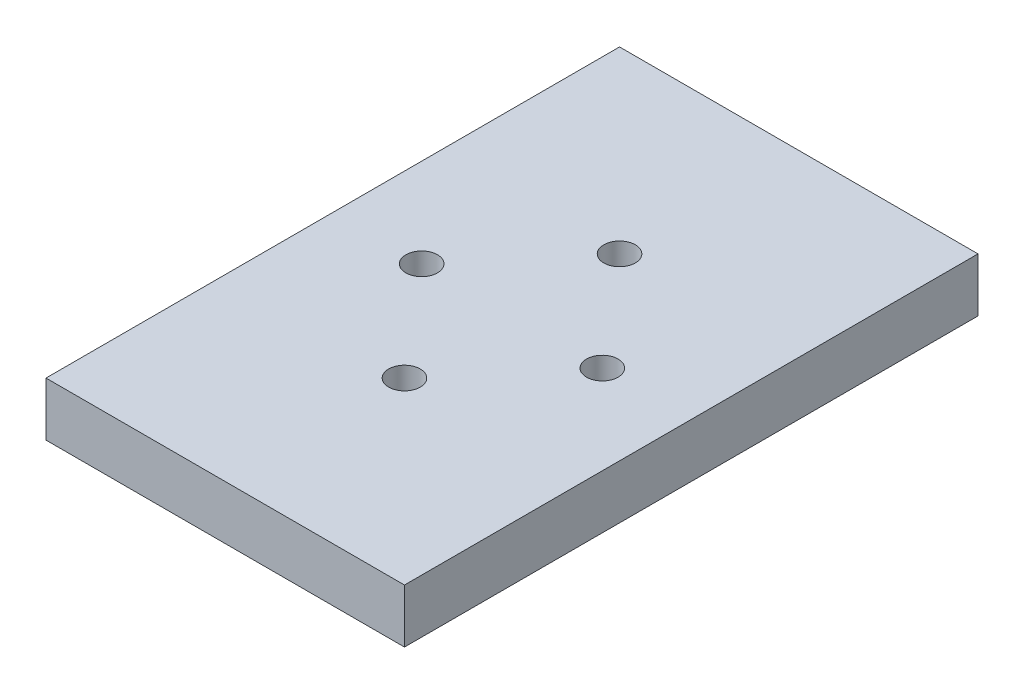
ISO-10303-21;
HEADER;
FILE_DESCRIPTION(('STEP AP214'),'2;1');
FILE_NAME('part.step','',(''),(''),'','','');
FILE_SCHEMA(('AUTOMOTIVE_DESIGN { 1 0 10303 214 1 1 1 1 }'));
ENDSEC;
DATA;
#1=APPLICATION_CONTEXT('core data for automotive mechanical design processes');
#2=APPLICATION_PROTOCOL_DEFINITION('international standard','automotive_design',2000,#1);
#3=PRODUCT_CONTEXT('',#1,'mechanical');
#4=PRODUCT('Part','Part','',(#3));
#5=PRODUCT_RELATED_PRODUCT_CATEGORY('part','',(#4));
#6=PRODUCT_DEFINITION_FORMATION('','',#4);
#7=PRODUCT_DEFINITION_CONTEXT('part definition',#1,'design');
#8=PRODUCT_DEFINITION('design','',#6,#7);
#9=PRODUCT_DEFINITION_SHAPE('','',#8);
#10=(LENGTH_UNIT() NAMED_UNIT(*) SI_UNIT(.MILLI.,.METRE.));
#11=(NAMED_UNIT(*) PLANE_ANGLE_UNIT() SI_UNIT($,.RADIAN.));
#12=(NAMED_UNIT(*) SI_UNIT($,.STERADIAN.) SOLID_ANGLE_UNIT());
#13=UNCERTAINTY_MEASURE_WITH_UNIT(LENGTH_MEASURE(1.E-05),#10,'distance_accuracy_value','');
#14=(GEOMETRIC_REPRESENTATION_CONTEXT(3) GLOBAL_UNCERTAINTY_ASSIGNED_CONTEXT((#13)) GLOBAL_UNIT_ASSIGNED_CONTEXT((#10,
#11,#12)) REPRESENTATION_CONTEXT('',''));
#15=CARTESIAN_POINT('',(0.,0.,0.));
#16=DIRECTION('',(0.,0.,1.));
#17=DIRECTION('',(1.,0.,0.));
#18=AXIS2_PLACEMENT_3D('',#15,#16,#17);
#19=CARTESIAN_POINT('',(0.,4.7625,0.));
#20=DIRECTION('',(0.,-1.,0.));
#21=DIRECTION('',(0.,0.,-1.));
#22=AXIS2_PLACEMENT_3D('',#19,#20,#21);
#23=PLANE('',#22);
#24=DIRECTION('',(0.,0.,1.));
#25=VECTOR('',#24,1.);
#26=CARTESIAN_POINT('',(0.,4.7625,0.));
#27=LINE('',#26,#25);
#28=CARTESIAN_POINT('',(0.,4.7625,-50.8));
#29=VERTEX_POINT('',#28);
#30=CARTESIAN_POINT('',(0.,4.7625,0.));
#31=VERTEX_POINT('',#30);
#32=EDGE_CURVE('E85',#29,#31,#27,.T.);
#33=ORIENTED_EDGE('',*,*,#32,.T.);
#34=DIRECTION('',(1.,0.,0.));
#35=VECTOR('',#34,1.);
#36=CARTESIAN_POINT('',(0.,4.7625,0.));
#37=LINE('',#36,#35);
#38=CARTESIAN_POINT('',(31.75,4.7625,0.));
#39=VERTEX_POINT('',#38);
#40=EDGE_CURVE('E80',#31,#39,#37,.T.);
#41=ORIENTED_EDGE('',*,*,#40,.T.);
#42=DIRECTION('',(0.,0.,-1.));
#43=VECTOR('',#42,1.);
#44=CARTESIAN_POINT('',(31.75,4.7625,0.));
#45=LINE('',#44,#43);
#46=CARTESIAN_POINT('',(31.75,4.7625,-50.8));
#47=VERTEX_POINT('',#46);
#48=EDGE_CURVE('E83',#39,#47,#45,.T.);
#49=ORIENTED_EDGE('',*,*,#48,.T.);
#50=DIRECTION('',(-1.,0.,0.));
#51=VECTOR('',#50,1.);
#52=CARTESIAN_POINT('',(0.,4.7625,-50.8));
#53=LINE('',#52,#51);
#54=EDGE_CURVE('E50',#47,#29,#53,.T.);
#55=ORIENTED_EDGE('',*,*,#54,.T.);
#56=EDGE_LOOP('',(#33,#41,#49,#55));
#57=FACE_BOUND('',#56,.T.);
#58=CARTESIAN_POINT('',(7.874,4.7625,-25.4));
#59=DIRECTION('',(0.,1.,0.));
#60=DIRECTION('',(0.,0.,1.));
#61=AXIS2_PLACEMENT_3D('',#58,#59,#60);
#62=CIRCLE('',#61,1.397);
#63=CARTESIAN_POINT('',(7.874,4.7625,-26.797));
#64=VERTEX_POINT('',#63);
#65=EDGE_CURVE('E100',#64,#64,#62,.T.);
#66=ORIENTED_EDGE('',*,*,#65,.F.);
#67=EDGE_LOOP('',(#66));
#68=FACE_BOUND('',#67,.T.);
#69=CARTESIAN_POINT('',(15.875,4.7625,-34.925));
#70=DIRECTION('',(0.,1.,0.));
#71=DIRECTION('',(0.,0.,1.));
#72=AXIS2_PLACEMENT_3D('',#69,#70,#71);
#73=CIRCLE('',#72,1.397);
#74=CARTESIAN_POINT('',(15.875,4.7625,-36.322));
#75=VERTEX_POINT('',#74);
#76=EDGE_CURVE('E115',#75,#75,#73,.T.);
#77=ORIENTED_EDGE('',*,*,#76,.F.);
#78=EDGE_LOOP('',(#77));
#79=FACE_BOUND('',#78,.T.);
#80=CARTESIAN_POINT('',(23.876,4.7625,-25.4));
#81=DIRECTION('',(0.,1.,0.));
#82=DIRECTION('',(0.,0.,1.));
#83=AXIS2_PLACEMENT_3D('',#80,#81,#82);
#84=CIRCLE('',#83,1.397);
#85=CARTESIAN_POINT('',(23.876,4.7625,-26.797));
#86=VERTEX_POINT('',#85);
#87=EDGE_CURVE('E121',#86,#86,#84,.T.);
#88=ORIENTED_EDGE('',*,*,#87,.F.);
#89=EDGE_LOOP('',(#88));
#90=FACE_BOUND('',#89,.T.);
#91=CARTESIAN_POINT('',(15.875,4.7625,-15.875));
#92=DIRECTION('',(0.,1.,0.));
#93=DIRECTION('',(0.,0.,1.));
#94=AXIS2_PLACEMENT_3D('',#91,#92,#93);
#95=CIRCLE('',#94,1.397);
#96=CARTESIAN_POINT('',(15.875,4.7625,-17.272));
#97=VERTEX_POINT('',#96);
#98=EDGE_CURVE('E127',#97,#97,#95,.T.);
#99=ORIENTED_EDGE('',*,*,#98,.F.);
#100=EDGE_LOOP('',(#99));
#101=FACE_BOUND('',#100,.T.);
#102=ADVANCED_FACE('F33',(#57,#68,#79,#90,#101),#23,.F.);
#103=CARTESIAN_POINT('',(0.,0.,0.));
#104=DIRECTION('',(0.,-1.,0.));
#105=DIRECTION('',(0.,0.,-1.));
#106=AXIS2_PLACEMENT_3D('',#103,#104,#105);
#107=PLANE('',#106);
#108=CARTESIAN_POINT('',(23.876,0.,-25.4));
#109=DIRECTION('',(0.,1.,0.));
#110=DIRECTION('',(0.,0.,1.));
#111=AXIS2_PLACEMENT_3D('',#108,#109,#110);
#112=CIRCLE('',#111,1.397);
#113=CARTESIAN_POINT('',(23.876,0.,-26.797));
#114=VERTEX_POINT('',#113);
#115=EDGE_CURVE('E124',#114,#114,#112,.T.);
#116=ORIENTED_EDGE('',*,*,#115,.T.);
#117=EDGE_LOOP('',(#116));
#118=FACE_BOUND('',#117,.T.);
#119=CARTESIAN_POINT('',(7.874,0.,-25.4));
#120=DIRECTION('',(0.,1.,0.));
#121=DIRECTION('',(0.,0.,1.));
#122=AXIS2_PLACEMENT_3D('',#119,#120,#121);
#123=CIRCLE('',#122,1.397);
#124=CARTESIAN_POINT('',(7.874,0.,-26.797));
#125=VERTEX_POINT('',#124);
#126=EDGE_CURVE('E112',#125,#125,#123,.T.);
#127=ORIENTED_EDGE('',*,*,#126,.T.);
#128=EDGE_LOOP('',(#127));
#129=FACE_BOUND('',#128,.T.);
#130=DIRECTION('',(0.,0.,1.));
#131=VECTOR('',#130,1.);
#132=CARTESIAN_POINT('',(0.,0.,0.));
#133=LINE('',#132,#131);
#134=CARTESIAN_POINT('',(0.,0.,-50.8));
#135=VERTEX_POINT('',#134);
#136=CARTESIAN_POINT('',(0.,0.,0.));
#137=VERTEX_POINT('',#136);
#138=EDGE_CURVE('E97',#135,#137,#133,.T.);
#139=ORIENTED_EDGE('',*,*,#138,.F.);
#140=DIRECTION('',(-1.,0.,0.));
#141=VECTOR('',#140,1.);
#142=CARTESIAN_POINT('',(0.,0.,-50.8));
#143=LINE('',#142,#141);
#144=CARTESIAN_POINT('',(31.75,0.,-50.8));
#145=VERTEX_POINT('',#144);
#146=EDGE_CURVE('E73',#145,#135,#143,.T.);
#147=ORIENTED_EDGE('',*,*,#146,.F.);
#148=DIRECTION('',(0.,0.,-1.));
#149=VECTOR('',#148,1.);
#150=CARTESIAN_POINT('',(31.75,0.,0.));
#151=LINE('',#150,#149);
#152=CARTESIAN_POINT('',(31.75,0.,0.));
#153=VERTEX_POINT('',#152);
#154=EDGE_CURVE('E67',#153,#145,#151,.T.);
#155=ORIENTED_EDGE('',*,*,#154,.F.);
#156=DIRECTION('',(1.,0.,0.));
#157=VECTOR('',#156,1.);
#158=CARTESIAN_POINT('',(0.,0.,0.));
#159=LINE('',#158,#157);
#160=EDGE_CURVE('E89',#137,#153,#159,.T.);
#161=ORIENTED_EDGE('',*,*,#160,.F.);
#162=EDGE_LOOP('',(#139,#147,#155,#161));
#163=FACE_BOUND('',#162,.T.);
#164=CARTESIAN_POINT('',(15.875,0.,-34.925));
#165=DIRECTION('',(0.,1.,0.));
#166=DIRECTION('',(0.,0.,1.));
#167=AXIS2_PLACEMENT_3D('',#164,#165,#166);
#168=CIRCLE('',#167,1.397);
#169=CARTESIAN_POINT('',(15.875,0.,-36.322));
#170=VERTEX_POINT('',#169);
#171=EDGE_CURVE('E118',#170,#170,#168,.T.);
#172=ORIENTED_EDGE('',*,*,#171,.T.);
#173=EDGE_LOOP('',(#172));
#174=FACE_BOUND('',#173,.T.);
#175=CARTESIAN_POINT('',(15.875,0.,-15.875));
#176=DIRECTION('',(0.,1.,0.));
#177=DIRECTION('',(0.,0.,1.));
#178=AXIS2_PLACEMENT_3D('',#175,#176,#177);
#179=CIRCLE('',#178,1.397);
#180=CARTESIAN_POINT('',(15.875,0.,-17.272));
#181=VERTEX_POINT('',#180);
#182=EDGE_CURVE('E130',#181,#181,#179,.T.);
#183=ORIENTED_EDGE('',*,*,#182,.T.);
#184=EDGE_LOOP('',(#183));
#185=FACE_BOUND('',#184,.T.);
#186=ADVANCED_FACE('F108',(#118,#129,#163,#174,#185),#107,.T.);
#187=CARTESIAN_POINT('',(0.,4.7625,0.));
#188=DIRECTION('',(1.,0.,0.));
#189=DIRECTION('',(0.,0.,-1.));
#190=AXIS2_PLACEMENT_3D('',#187,#188,#189);
#191=PLANE('',#190);
#192=ORIENTED_EDGE('',*,*,#138,.T.);
#193=DIRECTION('',(0.,-1.,0.));
#194=VECTOR('',#193,1.);
#195=CARTESIAN_POINT('',(0.,4.7625,0.));
#196=LINE('',#195,#194);
#197=EDGE_CURVE('E11',#31,#137,#196,.T.);
#198=ORIENTED_EDGE('',*,*,#197,.F.);
#199=ORIENTED_EDGE('',*,*,#32,.F.);
#200=DIRECTION('',(0.,-1.,0.));
#201=VECTOR('',#200,1.);
#202=CARTESIAN_POINT('',(0.,4.7625,-50.8));
#203=LINE('',#202,#201);
#204=EDGE_CURVE('E93',#29,#135,#203,.T.);
#205=ORIENTED_EDGE('',*,*,#204,.T.);
#206=EDGE_LOOP('',(#192,#198,#199,#205));
#207=FACE_BOUND('',#206,.T.);
#208=ADVANCED_FACE('F35',(#207),#191,.F.);
#209=CARTESIAN_POINT('',(0.,4.7625,0.));
#210=DIRECTION('',(0.,0.,-1.));
#211=DIRECTION('',(-1.,0.,0.));
#212=AXIS2_PLACEMENT_3D('',#209,#210,#211);
#213=PLANE('',#212);
#214=ORIENTED_EDGE('',*,*,#160,.T.);
#215=DIRECTION('',(0.,-1.,0.));
#216=VECTOR('',#215,1.);
#217=CARTESIAN_POINT('',(31.75,4.7625,0.));
#218=LINE('',#217,#216);
#219=EDGE_CURVE('E42',#39,#153,#218,.T.);
#220=ORIENTED_EDGE('',*,*,#219,.F.);
#221=ORIENTED_EDGE('',*,*,#40,.F.);
#222=ORIENTED_EDGE('',*,*,#197,.T.);
#223=EDGE_LOOP('',(#214,#220,#221,#222));
#224=FACE_BOUND('',#223,.T.);
#225=ADVANCED_FACE('F88',(#224),#213,.F.);
#226=CARTESIAN_POINT('',(31.75,4.7625,0.));
#227=DIRECTION('',(-1.,0.,0.));
#228=DIRECTION('',(0.,0.,1.));
#229=AXIS2_PLACEMENT_3D('',#226,#227,#228);
#230=PLANE('',#229);
#231=ORIENTED_EDGE('',*,*,#154,.T.);
#232=DIRECTION('',(0.,-1.,0.));
#233=VECTOR('',#232,1.);
#234=CARTESIAN_POINT('',(31.75,4.7625,-50.8));
#235=LINE('',#234,#233);
#236=EDGE_CURVE('E90',#47,#145,#235,.T.);
#237=ORIENTED_EDGE('',*,*,#236,.F.);
#238=ORIENTED_EDGE('',*,*,#48,.F.);
#239=ORIENTED_EDGE('',*,*,#219,.T.);
#240=EDGE_LOOP('',(#231,#237,#238,#239));
#241=FACE_BOUND('',#240,.T.);
#242=ADVANCED_FACE('F91',(#241),#230,.F.);
#243=CARTESIAN_POINT('',(0.,4.7625,-50.8));
#244=DIRECTION('',(0.,0.,1.));
#245=DIRECTION('',(1.,0.,0.));
#246=AXIS2_PLACEMENT_3D('',#243,#244,#245);
#247=PLANE('',#246);
#248=ORIENTED_EDGE('',*,*,#146,.T.);
#249=ORIENTED_EDGE('',*,*,#204,.F.);
#250=ORIENTED_EDGE('',*,*,#54,.F.);
#251=ORIENTED_EDGE('',*,*,#236,.T.);
#252=EDGE_LOOP('',(#248,#249,#250,#251));
#253=FACE_BOUND('',#252,.T.);
#254=ADVANCED_FACE('F105',(#253),#247,.F.);
#255=CARTESIAN_POINT('',(7.874,4.7625,-25.4));
#256=DIRECTION('',(0.,-1.,0.));
#257=DIRECTION('',(0.,0.,-1.));
#258=AXIS2_PLACEMENT_3D('',#255,#256,#257);
#259=CYLINDRICAL_SURFACE('',#258,1.397);
#260=CARTESIAN_POINT('',(7.874,4.7625,-26.797));
#261=CARTESIAN_POINT('',(7.874,4.712890625,-26.797));
#262=CARTESIAN_POINT('',(7.874,4.66328125,-26.797));
#263=CARTESIAN_POINT('',(7.874,4.5640625,-26.797));
#264=CARTESIAN_POINT('',(7.874,4.514453125,-26.797));
#265=CARTESIAN_POINT('',(7.874,4.415234375,-26.797));
#266=CARTESIAN_POINT('',(7.874,4.365625,-26.797));
#267=CARTESIAN_POINT('',(7.874,4.26640625,-26.797));
#268=CARTESIAN_POINT('',(7.874,4.216796875,-26.797));
#269=CARTESIAN_POINT('',(7.874,4.117578125,-26.797));
#270=CARTESIAN_POINT('',(7.874,4.06796875,-26.797));
#271=CARTESIAN_POINT('',(7.874,3.96875,-26.797));
#272=CARTESIAN_POINT('',(7.874,3.919140625,-26.797));
#273=CARTESIAN_POINT('',(7.874,3.819921875,-26.797));
#274=CARTESIAN_POINT('',(7.874,3.7703125,-26.797));
#275=CARTESIAN_POINT('',(7.874,3.67109375,-26.797));
#276=CARTESIAN_POINT('',(7.874,3.621484375,-26.797));
#277=CARTESIAN_POINT('',(7.874,3.522265625,-26.797));
#278=CARTESIAN_POINT('',(7.874,3.47265625,-26.797));
#279=CARTESIAN_POINT('',(7.874,3.3734375,-26.797));
#280=CARTESIAN_POINT('',(7.874,3.323828125,-26.797));
#281=CARTESIAN_POINT('',(7.874,3.224609375,-26.797));
#282=CARTESIAN_POINT('',(7.874,3.175,-26.797));
#283=CARTESIAN_POINT('',(7.874,3.07578125,-26.797));
#284=CARTESIAN_POINT('',(7.874,3.026171875,-26.797));
#285=CARTESIAN_POINT('',(7.874,2.926953125,-26.797));
#286=CARTESIAN_POINT('',(7.874,2.87734375,-26.797));
#287=CARTESIAN_POINT('',(7.874,2.778125,-26.797));
#288=CARTESIAN_POINT('',(7.874,2.728515625,-26.797));
#289=CARTESIAN_POINT('',(7.874,2.629296875,-26.797));
#290=CARTESIAN_POINT('',(7.874,2.5796875,-26.797));
#291=CARTESIAN_POINT('',(7.874,2.48046875,-26.797));
#292=CARTESIAN_POINT('',(7.874,2.430859375,-26.797));
#293=CARTESIAN_POINT('',(7.874,2.331640625,-26.797));
#294=CARTESIAN_POINT('',(7.874,2.28203125,-26.797));
#295=CARTESIAN_POINT('',(7.874,2.1828125,-26.797));
#296=CARTESIAN_POINT('',(7.874,2.133203125,-26.797));
#297=CARTESIAN_POINT('',(7.874,2.033984375,-26.797));
#298=CARTESIAN_POINT('',(7.874,1.984375,-26.797));
#299=CARTESIAN_POINT('',(7.874,1.88515625,-26.797));
#300=CARTESIAN_POINT('',(7.874,1.835546875,-26.797));
#301=CARTESIAN_POINT('',(7.874,1.736328125,-26.797));
#302=CARTESIAN_POINT('',(7.874,1.68671875,-26.797));
#303=CARTESIAN_POINT('',(7.874,1.5875,-26.797));
#304=CARTESIAN_POINT('',(7.874,1.537890625,-26.797));
#305=CARTESIAN_POINT('',(7.874,1.438671875,-26.797));
#306=CARTESIAN_POINT('',(7.874,1.3890625,-26.797));
#307=CARTESIAN_POINT('',(7.874,1.28984375,-26.797));
#308=CARTESIAN_POINT('',(7.874,1.240234375,-26.797));
#309=CARTESIAN_POINT('',(7.874,1.141015625,-26.797));
#310=CARTESIAN_POINT('',(7.874,1.09140625,-26.797));
#311=CARTESIAN_POINT('',(7.874,0.992187499999999,-26.797));
#312=CARTESIAN_POINT('',(7.874,0.942578124999999,-26.797));
#313=CARTESIAN_POINT('',(7.874,0.843359375,-26.797));
#314=CARTESIAN_POINT('',(7.874,0.79375,-26.797));
#315=CARTESIAN_POINT('',(7.874,0.69453125,-26.797));
#316=CARTESIAN_POINT('',(7.874,0.644921875,-26.797));
#317=CARTESIAN_POINT('',(7.874,0.545703125,-26.797));
#318=CARTESIAN_POINT('',(7.874,0.49609375,-26.797));
#319=CARTESIAN_POINT('',(7.874,0.396875,-26.797));
#320=CARTESIAN_POINT('',(7.874,0.347265625,-26.797));
#321=CARTESIAN_POINT('',(7.874,0.248046875,-26.797));
#322=CARTESIAN_POINT('',(7.874,0.1984375,-26.797));
#323=CARTESIAN_POINT('',(7.874,0.09921875,-26.797));
#324=CARTESIAN_POINT('',(7.874,0.049609375,-26.797));
#325=CARTESIAN_POINT('',(7.874,0.,-26.797));
#326=B_SPLINE_CURVE_WITH_KNOTS('',3,(#260,#261,#262,#263,#264,#265,#266,#267,#268,#269,#270,
#271,#272,#273,#274,#275,#276,#277,#278,#279,#280,#281,#282,#283,#284,#285,#286,#287,#288,#289,
#290,#291,#292,#293,#294,#295,#296,#297,#298,#299,#300,#301,#302,#303,#304,#305,#306,#307,#308,
#309,#310,#311,#312,#313,#314,#315,#316,#317,#318,#319,#320,#321,#322,#323,#324,#325),
.UNSPECIFIED.,.F.,.F.,(4,2,2,2,2,2,2,2,2,2,2,2,2,2,2,2,2,2,2,2,2,2,2,2,2,2,2,2,2,2,2,2,4),(0.,
0.148828125,0.29765625,0.446484375,0.5953125,0.744140625,0.892968750000001,1.041796875,1.190625,
1.339453125,1.48828125,1.637109375,1.7859375,1.934765625,2.08359375,2.232421875,2.38125,
2.530078125,2.67890625,2.827734375,2.9765625,3.125390625,3.27421875,3.423046875,3.571875,
3.720703125,3.86953125,4.018359375,4.1671875,4.316015625,4.46484375,4.613671875,4.7625),.UNSPECIFIED.);
#327=EDGE_CURVE('BSEAM147',#64,#125,#326,.T.);
#328=ORIENTED_EDGE('',*,*,#65,.T.);
#329=ORIENTED_EDGE('',*,*,#126,.F.);
#330=ORIENTED_EDGE('',*,*,#327,.T.);
#331=ORIENTED_EDGE('',*,*,#327,.F.);
#332=EDGE_LOOP('',(#328,#330,#329,#331));
#333=FACE_BOUND('',#332,.T.);
#334=ADVANCED_FACE('F147',(#333),#259,.F.);
#335=CARTESIAN_POINT('',(15.875,4.7625,-34.925));
#336=DIRECTION('',(0.,-1.,0.));
#337=DIRECTION('',(0.,0.,-1.));
#338=AXIS2_PLACEMENT_3D('',#335,#336,#337);
#339=CYLINDRICAL_SURFACE('',#338,1.397);
#340=CARTESIAN_POINT('',(15.875,4.7625,-36.322));
#341=CARTESIAN_POINT('',(15.875,4.712890625,-36.322));
#342=CARTESIAN_POINT('',(15.875,4.66328125,-36.322));
#343=CARTESIAN_POINT('',(15.875,4.5640625,-36.322));
#344=CARTESIAN_POINT('',(15.875,4.514453125,-36.322));
#345=CARTESIAN_POINT('',(15.875,4.415234375,-36.322));
#346=CARTESIAN_POINT('',(15.875,4.365625,-36.322));
#347=CARTESIAN_POINT('',(15.875,4.26640625,-36.322));
#348=CARTESIAN_POINT('',(15.875,4.216796875,-36.322));
#349=CARTESIAN_POINT('',(15.875,4.117578125,-36.322));
#350=CARTESIAN_POINT('',(15.875,4.06796875,-36.322));
#351=CARTESIAN_POINT('',(15.875,3.96875,-36.322));
#352=CARTESIAN_POINT('',(15.875,3.919140625,-36.322));
#353=CARTESIAN_POINT('',(15.875,3.819921875,-36.322));
#354=CARTESIAN_POINT('',(15.875,3.7703125,-36.322));
#355=CARTESIAN_POINT('',(15.875,3.67109375,-36.322));
#356=CARTESIAN_POINT('',(15.875,3.621484375,-36.322));
#357=CARTESIAN_POINT('',(15.875,3.522265625,-36.322));
#358=CARTESIAN_POINT('',(15.875,3.47265625,-36.322));
#359=CARTESIAN_POINT('',(15.875,3.3734375,-36.322));
#360=CARTESIAN_POINT('',(15.875,3.323828125,-36.322));
#361=CARTESIAN_POINT('',(15.875,3.224609375,-36.322));
#362=CARTESIAN_POINT('',(15.875,3.175,-36.322));
#363=CARTESIAN_POINT('',(15.875,3.07578125,-36.322));
#364=CARTESIAN_POINT('',(15.875,3.026171875,-36.322));
#365=CARTESIAN_POINT('',(15.875,2.926953125,-36.322));
#366=CARTESIAN_POINT('',(15.875,2.87734375,-36.322));
#367=CARTESIAN_POINT('',(15.875,2.778125,-36.322));
#368=CARTESIAN_POINT('',(15.875,2.728515625,-36.322));
#369=CARTESIAN_POINT('',(15.875,2.629296875,-36.322));
#370=CARTESIAN_POINT('',(15.875,2.5796875,-36.322));
#371=CARTESIAN_POINT('',(15.875,2.48046875,-36.322));
#372=CARTESIAN_POINT('',(15.875,2.430859375,-36.322));
#373=CARTESIAN_POINT('',(15.875,2.331640625,-36.322));
#374=CARTESIAN_POINT('',(15.875,2.28203125,-36.322));
#375=CARTESIAN_POINT('',(15.875,2.1828125,-36.322));
#376=CARTESIAN_POINT('',(15.875,2.133203125,-36.322));
#377=CARTESIAN_POINT('',(15.875,2.033984375,-36.322));
#378=CARTESIAN_POINT('',(15.875,1.984375,-36.322));
#379=CARTESIAN_POINT('',(15.875,1.88515625,-36.322));
#380=CARTESIAN_POINT('',(15.875,1.835546875,-36.322));
#381=CARTESIAN_POINT('',(15.875,1.736328125,-36.322));
#382=CARTESIAN_POINT('',(15.875,1.68671875,-36.322));
#383=CARTESIAN_POINT('',(15.875,1.5875,-36.322));
#384=CARTESIAN_POINT('',(15.875,1.537890625,-36.322));
#385=CARTESIAN_POINT('',(15.875,1.438671875,-36.322));
#386=CARTESIAN_POINT('',(15.875,1.3890625,-36.322));
#387=CARTESIAN_POINT('',(15.875,1.28984375,-36.322));
#388=CARTESIAN_POINT('',(15.875,1.240234375,-36.322));
#389=CARTESIAN_POINT('',(15.875,1.141015625,-36.322));
#390=CARTESIAN_POINT('',(15.875,1.09140625,-36.322));
#391=CARTESIAN_POINT('',(15.875,0.992187499999999,-36.322));
#392=CARTESIAN_POINT('',(15.875,0.942578124999999,-36.322));
#393=CARTESIAN_POINT('',(15.875,0.843359375,-36.322));
#394=CARTESIAN_POINT('',(15.875,0.79375,-36.322));
#395=CARTESIAN_POINT('',(15.875,0.69453125,-36.322));
#396=CARTESIAN_POINT('',(15.875,0.644921875,-36.322));
#397=CARTESIAN_POINT('',(15.875,0.545703125,-36.322));
#398=CARTESIAN_POINT('',(15.875,0.49609375,-36.322));
#399=CARTESIAN_POINT('',(15.875,0.396875,-36.322));
#400=CARTESIAN_POINT('',(15.875,0.347265625,-36.322));
#401=CARTESIAN_POINT('',(15.875,0.248046875,-36.322));
#402=CARTESIAN_POINT('',(15.875,0.1984375,-36.322));
#403=CARTESIAN_POINT('',(15.875,0.09921875,-36.322));
#404=CARTESIAN_POINT('',(15.875,0.049609375,-36.322));
#405=CARTESIAN_POINT('',(15.875,0.,-36.322));
#406=B_SPLINE_CURVE_WITH_KNOTS('',3,(#340,#341,#342,#343,#344,#345,#346,#347,#348,#349,#350,
#351,#352,#353,#354,#355,#356,#357,#358,#359,#360,#361,#362,#363,#364,#365,#366,#367,#368,#369,
#370,#371,#372,#373,#374,#375,#376,#377,#378,#379,#380,#381,#382,#383,#384,#385,#386,#387,#388,
#389,#390,#391,#392,#393,#394,#395,#396,#397,#398,#399,#400,#401,#402,#403,#404,#405),
.UNSPECIFIED.,.F.,.F.,(4,2,2,2,2,2,2,2,2,2,2,2,2,2,2,2,2,2,2,2,2,2,2,2,2,2,2,2,2,2,2,2,4),(0.,
0.148828125,0.29765625,0.446484375,0.5953125,0.744140625,0.892968750000001,1.041796875,1.190625,
1.339453125,1.48828125,1.637109375,1.7859375,1.934765625,2.08359375,2.232421875,2.38125,
2.530078125,2.67890625,2.827734375,2.9765625,3.125390625,3.27421875,3.423046875,3.571875,
3.720703125,3.86953125,4.018359375,4.1671875,4.316015625,4.46484375,4.613671875,4.7625),.UNSPECIFIED.);
#407=EDGE_CURVE('BSEAM193',#75,#170,#406,.T.);
#408=ORIENTED_EDGE('',*,*,#76,.T.);
#409=ORIENTED_EDGE('',*,*,#171,.F.);
#410=ORIENTED_EDGE('',*,*,#407,.T.);
#411=ORIENTED_EDGE('',*,*,#407,.F.);
#412=EDGE_LOOP('',(#408,#410,#409,#411));
#413=FACE_BOUND('',#412,.T.);
#414=ADVANCED_FACE('F193',(#413),#339,.F.);
#415=CARTESIAN_POINT('',(23.876,4.7625,-25.4));
#416=DIRECTION('',(0.,-1.,0.));
#417=DIRECTION('',(0.,0.,-1.));
#418=AXIS2_PLACEMENT_3D('',#415,#416,#417);
#419=CYLINDRICAL_SURFACE('',#418,1.397);
#420=CARTESIAN_POINT('',(23.876,4.7625,-26.797));
#421=CARTESIAN_POINT('',(23.876,4.712890625,-26.797));
#422=CARTESIAN_POINT('',(23.876,4.66328125,-26.797));
#423=CARTESIAN_POINT('',(23.876,4.5640625,-26.797));
#424=CARTESIAN_POINT('',(23.876,4.514453125,-26.797));
#425=CARTESIAN_POINT('',(23.876,4.415234375,-26.797));
#426=CARTESIAN_POINT('',(23.876,4.365625,-26.797));
#427=CARTESIAN_POINT('',(23.876,4.26640625,-26.797));
#428=CARTESIAN_POINT('',(23.876,4.216796875,-26.797));
#429=CARTESIAN_POINT('',(23.876,4.117578125,-26.797));
#430=CARTESIAN_POINT('',(23.876,4.06796875,-26.797));
#431=CARTESIAN_POINT('',(23.876,3.96875,-26.797));
#432=CARTESIAN_POINT('',(23.876,3.919140625,-26.797));
#433=CARTESIAN_POINT('',(23.876,3.819921875,-26.797));
#434=CARTESIAN_POINT('',(23.876,3.7703125,-26.797));
#435=CARTESIAN_POINT('',(23.876,3.67109375,-26.797));
#436=CARTESIAN_POINT('',(23.876,3.621484375,-26.797));
#437=CARTESIAN_POINT('',(23.876,3.522265625,-26.797));
#438=CARTESIAN_POINT('',(23.876,3.47265625,-26.797));
#439=CARTESIAN_POINT('',(23.876,3.3734375,-26.797));
#440=CARTESIAN_POINT('',(23.876,3.323828125,-26.797));
#441=CARTESIAN_POINT('',(23.876,3.224609375,-26.797));
#442=CARTESIAN_POINT('',(23.876,3.175,-26.797));
#443=CARTESIAN_POINT('',(23.876,3.07578125,-26.797));
#444=CARTESIAN_POINT('',(23.876,3.026171875,-26.797));
#445=CARTESIAN_POINT('',(23.876,2.926953125,-26.797));
#446=CARTESIAN_POINT('',(23.876,2.87734375,-26.797));
#447=CARTESIAN_POINT('',(23.876,2.778125,-26.797));
#448=CARTESIAN_POINT('',(23.876,2.728515625,-26.797));
#449=CARTESIAN_POINT('',(23.876,2.629296875,-26.797));
#450=CARTESIAN_POINT('',(23.876,2.5796875,-26.797));
#451=CARTESIAN_POINT('',(23.876,2.48046875,-26.797));
#452=CARTESIAN_POINT('',(23.876,2.430859375,-26.797));
#453=CARTESIAN_POINT('',(23.876,2.331640625,-26.797));
#454=CARTESIAN_POINT('',(23.876,2.28203125,-26.797));
#455=CARTESIAN_POINT('',(23.876,2.1828125,-26.797));
#456=CARTESIAN_POINT('',(23.876,2.133203125,-26.797));
#457=CARTESIAN_POINT('',(23.876,2.033984375,-26.797));
#458=CARTESIAN_POINT('',(23.876,1.984375,-26.797));
#459=CARTESIAN_POINT('',(23.876,1.88515625,-26.797));
#460=CARTESIAN_POINT('',(23.876,1.835546875,-26.797));
#461=CARTESIAN_POINT('',(23.876,1.736328125,-26.797));
#462=CARTESIAN_POINT('',(23.876,1.68671875,-26.797));
#463=CARTESIAN_POINT('',(23.876,1.5875,-26.797));
#464=CARTESIAN_POINT('',(23.876,1.537890625,-26.797));
#465=CARTESIAN_POINT('',(23.876,1.438671875,-26.797));
#466=CARTESIAN_POINT('',(23.876,1.3890625,-26.797));
#467=CARTESIAN_POINT('',(23.876,1.28984375,-26.797));
#468=CARTESIAN_POINT('',(23.876,1.240234375,-26.797));
#469=CARTESIAN_POINT('',(23.876,1.141015625,-26.797));
#470=CARTESIAN_POINT('',(23.876,1.09140625,-26.797));
#471=CARTESIAN_POINT('',(23.876,0.992187499999999,-26.797));
#472=CARTESIAN_POINT('',(23.876,0.942578124999999,-26.797));
#473=CARTESIAN_POINT('',(23.876,0.843359375,-26.797));
#474=CARTESIAN_POINT('',(23.876,0.79375,-26.797));
#475=CARTESIAN_POINT('',(23.876,0.69453125,-26.797));
#476=CARTESIAN_POINT('',(23.876,0.644921875,-26.797));
#477=CARTESIAN_POINT('',(23.876,0.545703125,-26.797));
#478=CARTESIAN_POINT('',(23.876,0.49609375,-26.797));
#479=CARTESIAN_POINT('',(23.876,0.396875,-26.797));
#480=CARTESIAN_POINT('',(23.876,0.347265625,-26.797));
#481=CARTESIAN_POINT('',(23.876,0.248046875,-26.797));
#482=CARTESIAN_POINT('',(23.876,0.1984375,-26.797));
#483=CARTESIAN_POINT('',(23.876,0.09921875,-26.797));
#484=CARTESIAN_POINT('',(23.876,0.049609375,-26.797));
#485=CARTESIAN_POINT('',(23.876,0.,-26.797));
#486=B_SPLINE_CURVE_WITH_KNOTS('',3,(#420,#421,#422,#423,#424,#425,#426,#427,#428,#429,#430,
#431,#432,#433,#434,#435,#436,#437,#438,#439,#440,#441,#442,#443,#444,#445,#446,#447,#448,#449,
#450,#451,#452,#453,#454,#455,#456,#457,#458,#459,#460,#461,#462,#463,#464,#465,#466,#467,#468,
#469,#470,#471,#472,#473,#474,#475,#476,#477,#478,#479,#480,#481,#482,#483,#484,#485),
.UNSPECIFIED.,.F.,.F.,(4,2,2,2,2,2,2,2,2,2,2,2,2,2,2,2,2,2,2,2,2,2,2,2,2,2,2,2,2,2,2,2,4),(0.,
0.148828125,0.29765625,0.446484375,0.5953125,0.744140625,0.892968750000001,1.041796875,1.190625,
1.339453125,1.48828125,1.637109375,1.7859375,1.934765625,2.08359375,2.232421875,2.38125,
2.530078125,2.67890625,2.827734375,2.9765625,3.125390625,3.27421875,3.423046875,3.571875,
3.720703125,3.86953125,4.018359375,4.1671875,4.316015625,4.46484375,4.613671875,4.7625),.UNSPECIFIED.);
#487=EDGE_CURVE('BSEAM201',#86,#114,#486,.T.);
#488=ORIENTED_EDGE('',*,*,#87,.T.);
#489=ORIENTED_EDGE('',*,*,#115,.F.);
#490=ORIENTED_EDGE('',*,*,#487,.T.);
#491=ORIENTED_EDGE('',*,*,#487,.F.);
#492=EDGE_LOOP('',(#488,#490,#489,#491));
#493=FACE_BOUND('',#492,.T.);
#494=ADVANCED_FACE('F201',(#493),#419,.F.);
#495=CARTESIAN_POINT('',(15.875,4.7625,-15.875));
#496=DIRECTION('',(0.,-1.,0.));
#497=DIRECTION('',(0.,0.,-1.));
#498=AXIS2_PLACEMENT_3D('',#495,#496,#497);
#499=CYLINDRICAL_SURFACE('',#498,1.397);
#500=CARTESIAN_POINT('',(15.875,4.7625,-17.272));
#501=CARTESIAN_POINT('',(15.875,4.712890625,-17.272));
#502=CARTESIAN_POINT('',(15.875,4.66328125,-17.272));
#503=CARTESIAN_POINT('',(15.875,4.5640625,-17.272));
#504=CARTESIAN_POINT('',(15.875,4.514453125,-17.272));
#505=CARTESIAN_POINT('',(15.875,4.415234375,-17.272));
#506=CARTESIAN_POINT('',(15.875,4.365625,-17.272));
#507=CARTESIAN_POINT('',(15.875,4.26640625,-17.272));
#508=CARTESIAN_POINT('',(15.875,4.216796875,-17.272));
#509=CARTESIAN_POINT('',(15.875,4.117578125,-17.272));
#510=CARTESIAN_POINT('',(15.875,4.06796875,-17.272));
#511=CARTESIAN_POINT('',(15.875,3.96875,-17.272));
#512=CARTESIAN_POINT('',(15.875,3.919140625,-17.272));
#513=CARTESIAN_POINT('',(15.875,3.819921875,-17.272));
#514=CARTESIAN_POINT('',(15.875,3.7703125,-17.272));
#515=CARTESIAN_POINT('',(15.875,3.67109375,-17.272));
#516=CARTESIAN_POINT('',(15.875,3.621484375,-17.272));
#517=CARTESIAN_POINT('',(15.875,3.522265625,-17.272));
#518=CARTESIAN_POINT('',(15.875,3.47265625,-17.272));
#519=CARTESIAN_POINT('',(15.875,3.3734375,-17.272));
#520=CARTESIAN_POINT('',(15.875,3.323828125,-17.272));
#521=CARTESIAN_POINT('',(15.875,3.224609375,-17.272));
#522=CARTESIAN_POINT('',(15.875,3.175,-17.272));
#523=CARTESIAN_POINT('',(15.875,3.07578125,-17.272));
#524=CARTESIAN_POINT('',(15.875,3.026171875,-17.272));
#525=CARTESIAN_POINT('',(15.875,2.926953125,-17.272));
#526=CARTESIAN_POINT('',(15.875,2.87734375,-17.272));
#527=CARTESIAN_POINT('',(15.875,2.778125,-17.272));
#528=CARTESIAN_POINT('',(15.875,2.728515625,-17.272));
#529=CARTESIAN_POINT('',(15.875,2.629296875,-17.272));
#530=CARTESIAN_POINT('',(15.875,2.5796875,-17.272));
#531=CARTESIAN_POINT('',(15.875,2.48046875,-17.272));
#532=CARTESIAN_POINT('',(15.875,2.430859375,-17.272));
#533=CARTESIAN_POINT('',(15.875,2.331640625,-17.272));
#534=CARTESIAN_POINT('',(15.875,2.28203125,-17.272));
#535=CARTESIAN_POINT('',(15.875,2.1828125,-17.272));
#536=CARTESIAN_POINT('',(15.875,2.133203125,-17.272));
#537=CARTESIAN_POINT('',(15.875,2.033984375,-17.272));
#538=CARTESIAN_POINT('',(15.875,1.984375,-17.272));
#539=CARTESIAN_POINT('',(15.875,1.88515625,-17.272));
#540=CARTESIAN_POINT('',(15.875,1.835546875,-17.272));
#541=CARTESIAN_POINT('',(15.875,1.736328125,-17.272));
#542=CARTESIAN_POINT('',(15.875,1.68671875,-17.272));
#543=CARTESIAN_POINT('',(15.875,1.5875,-17.272));
#544=CARTESIAN_POINT('',(15.875,1.537890625,-17.272));
#545=CARTESIAN_POINT('',(15.875,1.438671875,-17.272));
#546=CARTESIAN_POINT('',(15.875,1.3890625,-17.272));
#547=CARTESIAN_POINT('',(15.875,1.28984375,-17.272));
#548=CARTESIAN_POINT('',(15.875,1.240234375,-17.272));
#549=CARTESIAN_POINT('',(15.875,1.141015625,-17.272));
#550=CARTESIAN_POINT('',(15.875,1.09140625,-17.272));
#551=CARTESIAN_POINT('',(15.875,0.992187499999999,-17.272));
#552=CARTESIAN_POINT('',(15.875,0.942578124999999,-17.272));
#553=CARTESIAN_POINT('',(15.875,0.843359375,-17.272));
#554=CARTESIAN_POINT('',(15.875,0.79375,-17.272));
#555=CARTESIAN_POINT('',(15.875,0.69453125,-17.272));
#556=CARTESIAN_POINT('',(15.875,0.644921875,-17.272));
#557=CARTESIAN_POINT('',(15.875,0.545703125,-17.272));
#558=CARTESIAN_POINT('',(15.875,0.49609375,-17.272));
#559=CARTESIAN_POINT('',(15.875,0.396875,-17.272));
#560=CARTESIAN_POINT('',(15.875,0.347265625,-17.272));
#561=CARTESIAN_POINT('',(15.875,0.248046875,-17.272));
#562=CARTESIAN_POINT('',(15.875,0.1984375,-17.272));
#563=CARTESIAN_POINT('',(15.875,0.09921875,-17.272));
#564=CARTESIAN_POINT('',(15.875,0.049609375,-17.272));
#565=CARTESIAN_POINT('',(15.875,0.,-17.272));
#566=B_SPLINE_CURVE_WITH_KNOTS('',3,(#500,#501,#502,#503,#504,#505,#506,#507,#508,#509,#510,
#511,#512,#513,#514,#515,#516,#517,#518,#519,#520,#521,#522,#523,#524,#525,#526,#527,#528,#529,
#530,#531,#532,#533,#534,#535,#536,#537,#538,#539,#540,#541,#542,#543,#544,#545,#546,#547,#548,
#549,#550,#551,#552,#553,#554,#555,#556,#557,#558,#559,#560,#561,#562,#563,#564,#565),
.UNSPECIFIED.,.F.,.F.,(4,2,2,2,2,2,2,2,2,2,2,2,2,2,2,2,2,2,2,2,2,2,2,2,2,2,2,2,2,2,2,2,4),(0.,
0.148828125,0.29765625,0.446484375,0.5953125,0.744140625,0.892968750000001,1.041796875,1.190625,
1.339453125,1.48828125,1.637109375,1.7859375,1.934765625,2.08359375,2.232421875,2.38125,
2.530078125,2.67890625,2.827734375,2.9765625,3.125390625,3.27421875,3.423046875,3.571875,
3.720703125,3.86953125,4.018359375,4.1671875,4.316015625,4.46484375,4.613671875,4.7625),.UNSPECIFIED.);
#567=EDGE_CURVE('BSEAM136',#97,#181,#566,.T.);
#568=ORIENTED_EDGE('',*,*,#98,.T.);
#569=ORIENTED_EDGE('',*,*,#182,.F.);
#570=ORIENTED_EDGE('',*,*,#567,.T.);
#571=ORIENTED_EDGE('',*,*,#567,.F.);
#572=EDGE_LOOP('',(#568,#570,#569,#571));
#573=FACE_BOUND('',#572,.T.);
#574=ADVANCED_FACE('F136',(#573),#499,.F.);
#575=CLOSED_SHELL('',(#102,#186,#208,#225,#242,#254,#334,#414,#494,#574));
#576=MANIFOLD_SOLID_BREP('B2',#575);
#577=ADVANCED_BREP_SHAPE_REPRESENTATION('',(#18,#576),#14);
#578=SHAPE_DEFINITION_REPRESENTATION(#9,#577);
ENDSEC;
END-ISO-10303-21;
